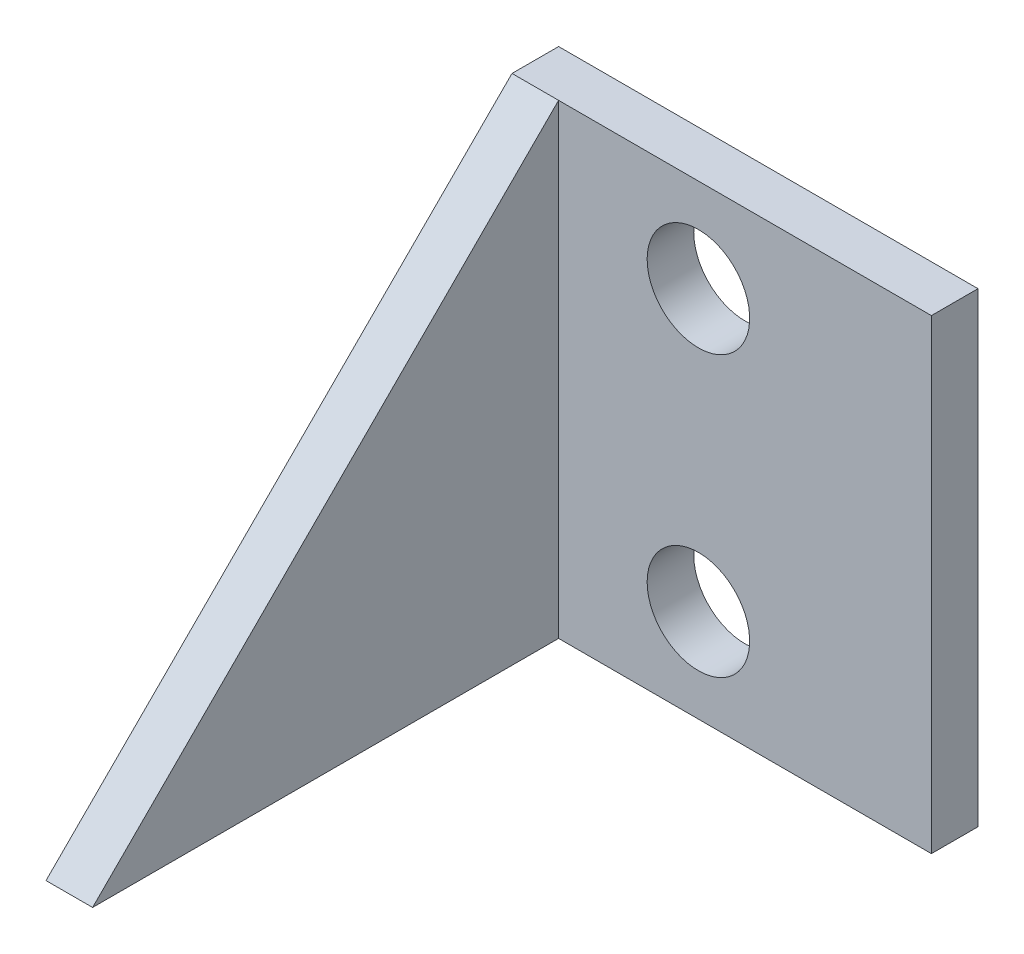
ISO-10303-21;
HEADER;
FILE_DESCRIPTION(('STEP AP214'),'2;1');
FILE_NAME('part.step','',(''),(''),'','','');
FILE_SCHEMA(('AUTOMOTIVE_DESIGN { 1 0 10303 214 1 1 1 1 }'));
ENDSEC;
DATA;
#1=APPLICATION_CONTEXT('core data for automotive mechanical design processes');
#2=APPLICATION_PROTOCOL_DEFINITION('international standard','automotive_design',2000,#1);
#3=PRODUCT_CONTEXT('',#1,'mechanical');
#4=PRODUCT('Part','Part','',(#3));
#5=PRODUCT_RELATED_PRODUCT_CATEGORY('part','',(#4));
#6=PRODUCT_DEFINITION_FORMATION('','',#4);
#7=PRODUCT_DEFINITION_CONTEXT('part definition',#1,'design');
#8=PRODUCT_DEFINITION('design','',#6,#7);
#9=PRODUCT_DEFINITION_SHAPE('','',#8);
#10=(LENGTH_UNIT() NAMED_UNIT(*) SI_UNIT(.MILLI.,.METRE.));
#11=(NAMED_UNIT(*) PLANE_ANGLE_UNIT() SI_UNIT($,.RADIAN.));
#12=(NAMED_UNIT(*) SI_UNIT($,.STERADIAN.) SOLID_ANGLE_UNIT());
#13=UNCERTAINTY_MEASURE_WITH_UNIT(LENGTH_MEASURE(1.E-05),#10,'distance_accuracy_value','');
#14=(GEOMETRIC_REPRESENTATION_CONTEXT(3) GLOBAL_UNCERTAINTY_ASSIGNED_CONTEXT((#13)) GLOBAL_UNIT_ASSIGNED_CONTEXT((#10,
#11,#12)) REPRESENTATION_CONTEXT('',''));
#15=CARTESIAN_POINT('',(0.,0.,0.));
#16=DIRECTION('',(0.,0.,1.));
#17=DIRECTION('',(1.,0.,0.));
#18=AXIS2_PLACEMENT_3D('',#15,#16,#17);
#19=CARTESIAN_POINT('',(-12.,0.,0.));
#20=DIRECTION('',(-1.,0.,0.));
#21=DIRECTION('',(0.,0.,1.));
#22=AXIS2_PLACEMENT_3D('',#19,#20,#21);
#23=PLANE('',#22);
#24=DIRECTION('',(0.,-1.,0.));
#25=VECTOR('',#24,1.);
#26=CARTESIAN_POINT('',(-12.,-15.,3.));
#27=LINE('',#26,#25);
#28=CARTESIAN_POINT('',(-12.,15.,3.));
#29=VERTEX_POINT('',#28);
#30=CARTESIAN_POINT('',(-12.,-15.,3.));
#31=VERTEX_POINT('',#30);
#32=EDGE_CURVE('E63',#29,#31,#27,.T.);
#33=ORIENTED_EDGE('',*,*,#32,.F.);
#34=DIRECTION('',(0.,-0.707106781186548,0.707106781186547));
#35=VECTOR('',#34,1.);
#36=CARTESIAN_POINT('',(-12.,15.,3.));
#37=LINE('',#36,#35);
#38=CARTESIAN_POINT('',(-12.,-15.,33.));
#39=VERTEX_POINT('',#38);
#40=EDGE_CURVE('E114',#29,#39,#37,.T.);
#41=ORIENTED_EDGE('',*,*,#40,.T.);
#42=DIRECTION('',(0.,0.,-1.));
#43=VECTOR('',#42,1.);
#44=CARTESIAN_POINT('',(-12.,-15.,33.));
#45=LINE('',#44,#43);
#46=EDGE_CURVE('E94',#39,#31,#45,.T.);
#47=ORIENTED_EDGE('',*,*,#46,.T.);
#48=EDGE_LOOP('',(#33,#41,#47));
#49=FACE_BOUND('',#48,.T.);
#50=ADVANCED_FACE('F33',(#49),#23,.F.);
#51=CARTESIAN_POINT('',(-15.,15.,0.));
#52=DIRECTION('',(0.,1.,0.));
#53=DIRECTION('',(0.,0.,1.));
#54=AXIS2_PLACEMENT_3D('',#51,#52,#53);
#55=PLANE('',#54);
#56=DIRECTION('',(1.,0.,0.));
#57=VECTOR('',#56,1.);
#58=CARTESIAN_POINT('',(-15.,15.,3.));
#59=LINE('',#58,#57);
#60=CARTESIAN_POINT('',(-15.,15.,3.));
#61=VERTEX_POINT('',#60);
#62=EDGE_CURVE('E98',#61,#29,#59,.T.);
#63=ORIENTED_EDGE('',*,*,#62,.T.);
#64=DIRECTION('',(-1.,0.,0.));
#65=VECTOR('',#64,1.);
#66=CARTESIAN_POINT('',(12.,15.,3.));
#67=LINE('',#66,#65);
#68=CARTESIAN_POINT('',(12.,15.,3.));
#69=VERTEX_POINT('',#68);
#70=EDGE_CURVE('E140',#69,#29,#67,.T.);
#71=ORIENTED_EDGE('',*,*,#70,.F.);
#72=DIRECTION('',(0.,0.,1.));
#73=VECTOR('',#72,1.);
#74=CARTESIAN_POINT('',(12.,15.,3.));
#75=LINE('',#74,#73);
#76=CARTESIAN_POINT('',(12.,15.,0.));
#77=VERTEX_POINT('',#76);
#78=EDGE_CURVE('E73',#77,#69,#75,.T.);
#79=ORIENTED_EDGE('',*,*,#78,.F.);
#80=DIRECTION('',(1.,0.,0.));
#81=VECTOR('',#80,1.);
#82=CARTESIAN_POINT('',(-15.,15.,0.));
#83=LINE('',#82,#81);
#84=CARTESIAN_POINT('',(-15.,15.,0.));
#85=VERTEX_POINT('',#84);
#86=EDGE_CURVE('E11',#85,#77,#83,.T.);
#87=ORIENTED_EDGE('',*,*,#86,.F.);
#88=DIRECTION('',(0.,0.,1.));
#89=VECTOR('',#88,1.);
#90=CARTESIAN_POINT('',(-15.,15.,0.));
#91=LINE('',#90,#89);
#92=EDGE_CURVE('E108',#85,#61,#91,.T.);
#93=ORIENTED_EDGE('',*,*,#92,.T.);
#94=EDGE_LOOP('',(#63,#71,#79,#87,#93));
#95=FACE_BOUND('',#94,.T.);
#96=ADVANCED_FACE('F35',(#95),#55,.T.);
#97=CARTESIAN_POINT('',(-15.,-15.,0.));
#98=DIRECTION('',(0.,0.,-1.));
#99=DIRECTION('',(-1.,0.,0.));
#100=AXIS2_PLACEMENT_3D('',#97,#98,#99);
#101=PLANE('',#100);
#102=CARTESIAN_POINT('',(-3.,-9.00000000000001,0.));
#103=DIRECTION('',(0.,0.,-1.));
#104=DIRECTION('',(-1.,0.,0.));
#105=AXIS2_PLACEMENT_3D('',#102,#103,#104);
#106=CIRCLE('',#105,3.3);
#107=CARTESIAN_POINT('',(-6.3,-9.00000000000001,0.));
#108=VERTEX_POINT('',#107);
#109=EDGE_CURVE('E131',#108,#108,#106,.T.);
#110=ORIENTED_EDGE('',*,*,#109,.F.);
#111=EDGE_LOOP('',(#110));
#112=FACE_BOUND('',#111,.T.);
#113=CARTESIAN_POINT('',(-3.,9.,0.));
#114=DIRECTION('',(0.,0.,-1.));
#115=DIRECTION('',(-1.,0.,0.));
#116=AXIS2_PLACEMENT_3D('',#113,#114,#115);
#117=CIRCLE('',#116,3.3);
#118=CARTESIAN_POINT('',(-6.3,9.,0.));
#119=VERTEX_POINT('',#118);
#120=EDGE_CURVE('E121',#119,#119,#117,.T.);
#121=ORIENTED_EDGE('',*,*,#120,.F.);
#122=EDGE_LOOP('',(#121));
#123=FACE_BOUND('',#122,.T.);
#124=ORIENTED_EDGE('',*,*,#86,.T.);
#125=DIRECTION('',(0.,1.,0.));
#126=VECTOR('',#125,1.);
#127=CARTESIAN_POINT('',(12.,15.,0.));
#128=LINE('',#127,#126);
#129=CARTESIAN_POINT('',(12.,-15.,0.));
#130=VERTEX_POINT('',#129);
#131=EDGE_CURVE('E138',#130,#77,#128,.T.);
#132=ORIENTED_EDGE('',*,*,#131,.F.);
#133=DIRECTION('',(1.,0.,0.));
#134=VECTOR('',#133,1.);
#135=CARTESIAN_POINT('',(-15.,-15.,0.));
#136=LINE('',#135,#134);
#137=CARTESIAN_POINT('',(-15.,-15.,0.));
#138=VERTEX_POINT('',#137);
#139=EDGE_CURVE('E43',#138,#130,#136,.T.);
#140=ORIENTED_EDGE('',*,*,#139,.F.);
#141=DIRECTION('',(0.,1.,0.));
#142=VECTOR('',#141,1.);
#143=CARTESIAN_POINT('',(-15.,-15.,0.));
#144=LINE('',#143,#142);
#145=EDGE_CURVE('E105',#138,#85,#144,.T.);
#146=ORIENTED_EDGE('',*,*,#145,.T.);
#147=EDGE_LOOP('',(#124,#132,#140,#146));
#148=FACE_BOUND('',#147,.T.);
#149=ADVANCED_FACE('F153',(#112,#123,#148),#101,.T.);
#150=CARTESIAN_POINT('',(-15.,-15.,33.));
#151=DIRECTION('',(0.,-1.,0.));
#152=DIRECTION('',(0.,0.,-1.));
#153=AXIS2_PLACEMENT_3D('',#150,#151,#152);
#154=PLANE('',#153);
#155=ORIENTED_EDGE('',*,*,#46,.F.);
#156=DIRECTION('',(1.,0.,0.));
#157=VECTOR('',#156,1.);
#158=CARTESIAN_POINT('',(-15.,-15.,33.));
#159=LINE('',#158,#157);
#160=CARTESIAN_POINT('',(-15.,-15.,33.));
#161=VERTEX_POINT('',#160);
#162=EDGE_CURVE('E87',#161,#39,#159,.T.);
#163=ORIENTED_EDGE('',*,*,#162,.F.);
#164=DIRECTION('',(0.,0.,-1.));
#165=VECTOR('',#164,1.);
#166=CARTESIAN_POINT('',(-15.,-15.,33.));
#167=LINE('',#166,#165);
#168=EDGE_CURVE('E91',#161,#138,#167,.T.);
#169=ORIENTED_EDGE('',*,*,#168,.T.);
#170=ORIENTED_EDGE('',*,*,#139,.T.);
#171=DIRECTION('',(0.,0.,-1.));
#172=VECTOR('',#171,1.);
#173=CARTESIAN_POINT('',(12.,-15.,0.));
#174=LINE('',#173,#172);
#175=CARTESIAN_POINT('',(12.,-15.,3.));
#176=VERTEX_POINT('',#175);
#177=EDGE_CURVE('E135',#176,#130,#174,.T.);
#178=ORIENTED_EDGE('',*,*,#177,.F.);
#179=DIRECTION('',(-1.,0.,0.));
#180=VECTOR('',#179,1.);
#181=CARTESIAN_POINT('',(12.,-15.,3.));
#182=LINE('',#181,#180);
#183=EDGE_CURVE('E116',#176,#31,#182,.T.);
#184=ORIENTED_EDGE('',*,*,#183,.T.);
#185=EDGE_LOOP('',(#155,#163,#169,#170,#178,#184));
#186=FACE_BOUND('',#185,.T.);
#187=ADVANCED_FACE('F89',(#186),#154,.T.);
#188=CARTESIAN_POINT('',(-15.,15.,3.));
#189=DIRECTION('',(0.,0.707106781186547,0.707106781186547));
#190=DIRECTION('',(0.,-0.707106781186548,0.707106781186548));
#191=AXIS2_PLACEMENT_3D('',#188,#189,#190);
#192=PLANE('',#191);
#193=ORIENTED_EDGE('',*,*,#40,.F.);
#194=ORIENTED_EDGE('',*,*,#62,.F.);
#195=DIRECTION('',(0.,-0.707106781186548,0.707106781186547));
#196=VECTOR('',#195,1.);
#197=CARTESIAN_POINT('',(-15.,15.,3.));
#198=LINE('',#197,#196);
#199=EDGE_CURVE('E103',#61,#161,#198,.T.);
#200=ORIENTED_EDGE('',*,*,#199,.T.);
#201=ORIENTED_EDGE('',*,*,#162,.T.);
#202=EDGE_LOOP('',(#193,#194,#200,#201));
#203=FACE_BOUND('',#202,.T.);
#204=ADVANCED_FACE('F107',(#203),#192,.T.);
#205=CARTESIAN_POINT('',(-15.,0.,0.));
#206=DIRECTION('',(-1.,0.,0.));
#207=DIRECTION('',(0.,0.,1.));
#208=AXIS2_PLACEMENT_3D('',#205,#206,#207);
#209=PLANE('',#208);
#210=ORIENTED_EDGE('',*,*,#92,.F.);
#211=ORIENTED_EDGE('',*,*,#145,.F.);
#212=ORIENTED_EDGE('',*,*,#168,.F.);
#213=ORIENTED_EDGE('',*,*,#199,.F.);
#214=EDGE_LOOP('',(#210,#211,#212,#213));
#215=FACE_BOUND('',#214,.T.);
#216=ADVANCED_FACE('F102',(#215),#209,.T.);
#217=CARTESIAN_POINT('',(12.,-15.,3.));
#218=DIRECTION('',(0.,0.,-1.));
#219=DIRECTION('',(-1.,0.,0.));
#220=AXIS2_PLACEMENT_3D('',#217,#218,#219);
#221=PLANE('',#220);
#222=CARTESIAN_POINT('',(-3.,-9.00000000000001,3.));
#223=DIRECTION('',(0.,0.,-1.));
#224=DIRECTION('',(-1.,0.,0.));
#225=AXIS2_PLACEMENT_3D('',#222,#223,#224);
#226=CIRCLE('',#225,3.3);
#227=CARTESIAN_POINT('',(-6.3,-9.00000000000001,3.));
#228=VERTEX_POINT('',#227);
#229=EDGE_CURVE('E37',#228,#228,#226,.T.);
#230=ORIENTED_EDGE('',*,*,#229,.T.);
#231=EDGE_LOOP('',(#230));
#232=FACE_BOUND('',#231,.T.);
#233=CARTESIAN_POINT('',(-3.,9.,3.));
#234=DIRECTION('',(0.,0.,-1.));
#235=DIRECTION('',(-1.,0.,0.));
#236=AXIS2_PLACEMENT_3D('',#233,#234,#235);
#237=CIRCLE('',#236,3.3);
#238=CARTESIAN_POINT('',(-6.3,9.,3.));
#239=VERTEX_POINT('',#238);
#240=EDGE_CURVE('E119',#239,#239,#237,.T.);
#241=ORIENTED_EDGE('',*,*,#240,.T.);
#242=EDGE_LOOP('',(#241));
#243=FACE_BOUND('',#242,.T.);
#244=ORIENTED_EDGE('',*,*,#32,.T.);
#245=ORIENTED_EDGE('',*,*,#183,.F.);
#246=DIRECTION('',(0.,-1.,0.));
#247=VECTOR('',#246,1.);
#248=CARTESIAN_POINT('',(12.,-15.,3.));
#249=LINE('',#248,#247);
#250=EDGE_CURVE('E124',#69,#176,#249,.T.);
#251=ORIENTED_EDGE('',*,*,#250,.F.);
#252=ORIENTED_EDGE('',*,*,#70,.T.);
#253=EDGE_LOOP('',(#244,#245,#251,#252));
#254=FACE_BOUND('',#253,.T.);
#255=ADVANCED_FACE('F147',(#232,#243,#254),#221,.F.);
#256=CARTESIAN_POINT('',(12.,0.,0.));
#257=DIRECTION('',(-1.,0.,0.));
#258=DIRECTION('',(0.,0.,1.));
#259=AXIS2_PLACEMENT_3D('',#256,#257,#258);
#260=PLANE('',#259);
#261=ORIENTED_EDGE('',*,*,#250,.T.);
#262=ORIENTED_EDGE('',*,*,#177,.T.);
#263=ORIENTED_EDGE('',*,*,#131,.T.);
#264=ORIENTED_EDGE('',*,*,#78,.T.);
#265=EDGE_LOOP('',(#261,#262,#263,#264));
#266=FACE_BOUND('',#265,.T.);
#267=ADVANCED_FACE('F168',(#266),#260,.F.);
#268=CARTESIAN_POINT('',(-3.,9.,10.));
#269=DIRECTION('',(0.,0.,-1.));
#270=DIRECTION('',(-1.,0.,0.));
#271=AXIS2_PLACEMENT_3D('',#268,#269,#270);
#272=CYLINDRICAL_SURFACE('',#271,3.3);
#273=ORIENTED_EDGE('',*,*,#120,.T.);
#274=EDGE_LOOP('',(#273));
#275=FACE_BOUND('',#274,.T.);
#276=ORIENTED_EDGE('',*,*,#240,.F.);
#277=EDGE_LOOP('',(#276));
#278=FACE_BOUND('',#277,.T.);
#279=ADVANCED_FACE('F173',(#275,#278),#272,.F.);
#280=CARTESIAN_POINT('',(-3.,-9.00000000000001,10.));
#281=DIRECTION('',(0.,0.,-1.));
#282=DIRECTION('',(-1.,0.,0.));
#283=AXIS2_PLACEMENT_3D('',#280,#281,#282);
#284=CYLINDRICAL_SURFACE('',#283,3.3);
#285=ORIENTED_EDGE('',*,*,#109,.T.);
#286=EDGE_LOOP('',(#285));
#287=FACE_BOUND('',#286,.T.);
#288=ORIENTED_EDGE('',*,*,#229,.F.);
#289=EDGE_LOOP('',(#288));
#290=FACE_BOUND('',#289,.T.);
#291=ADVANCED_FACE('F178',(#287,#290),#284,.F.);
#292=CLOSED_SHELL('',(#50,#96,#149,#187,#204,#216,#255,#267,#279,#291));
#293=MANIFOLD_SOLID_BREP('B2',#292);
#294=ADVANCED_BREP_SHAPE_REPRESENTATION('',(#18,#293),#14);
#295=SHAPE_DEFINITION_REPRESENTATION(#9,#294);
ENDSEC;
END-ISO-10303-21;
